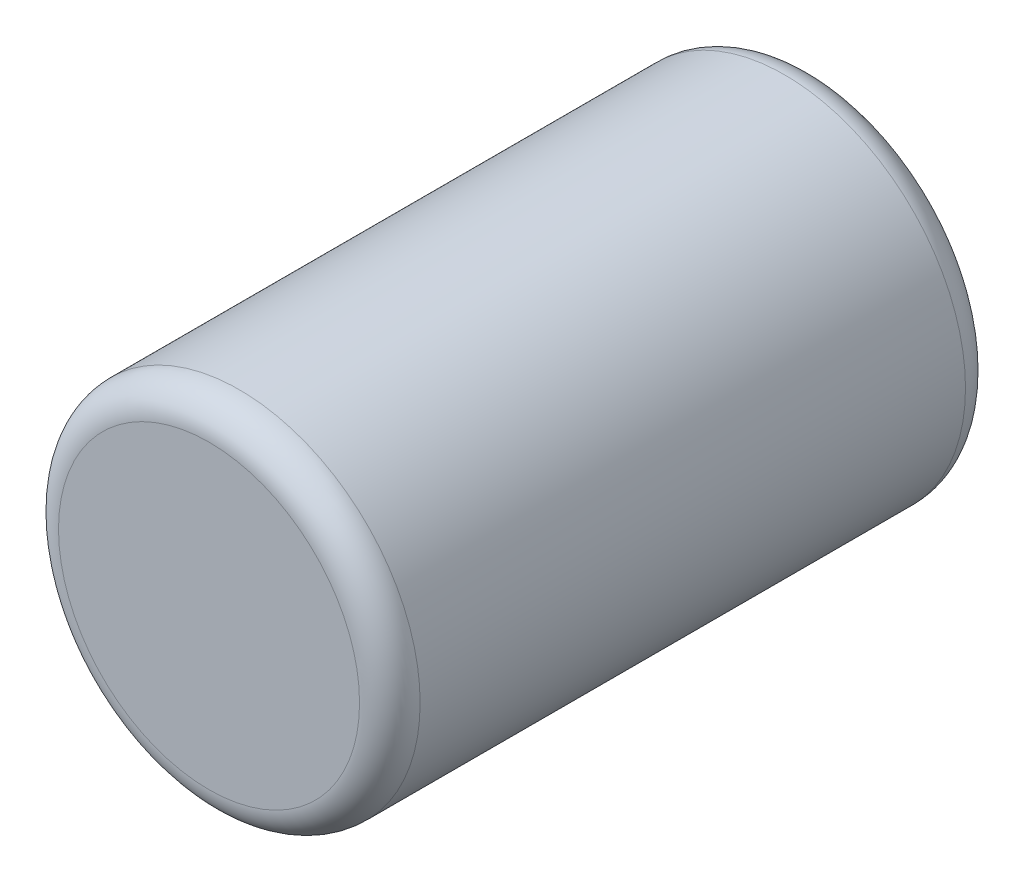
ISO-10303-21;
HEADER;
FILE_DESCRIPTION(('STEP AP214'),'2;1');
FILE_NAME('part.step','',(''),(''),'','','');
FILE_SCHEMA(('AUTOMOTIVE_DESIGN { 1 0 10303 214 1 1 1 1 }'));
ENDSEC;
DATA;
#1=APPLICATION_CONTEXT('core data for automotive mechanical design processes');
#2=APPLICATION_PROTOCOL_DEFINITION('international standard','automotive_design',2000,#1);
#3=PRODUCT_CONTEXT('',#1,'mechanical');
#4=PRODUCT('Part','Part','',(#3));
#5=PRODUCT_RELATED_PRODUCT_CATEGORY('part','',(#4));
#6=PRODUCT_DEFINITION_FORMATION('','',#4);
#7=PRODUCT_DEFINITION_CONTEXT('part definition',#1,'design');
#8=PRODUCT_DEFINITION('design','',#6,#7);
#9=PRODUCT_DEFINITION_SHAPE('','',#8);
#10=(LENGTH_UNIT() NAMED_UNIT(*) SI_UNIT(.MILLI.,.METRE.));
#11=(NAMED_UNIT(*) PLANE_ANGLE_UNIT() SI_UNIT($,.RADIAN.));
#12=(NAMED_UNIT(*) SI_UNIT($,.STERADIAN.) SOLID_ANGLE_UNIT());
#13=UNCERTAINTY_MEASURE_WITH_UNIT(LENGTH_MEASURE(1.E-05),#10,'distance_accuracy_value','');
#14=(GEOMETRIC_REPRESENTATION_CONTEXT(3) GLOBAL_UNCERTAINTY_ASSIGNED_CONTEXT((#13)) GLOBAL_UNIT_ASSIGNED_CONTEXT((#10,
#11,#12)) REPRESENTATION_CONTEXT('',''));
#15=CARTESIAN_POINT('',(0.,0.,0.));
#16=DIRECTION('',(0.,0.,1.));
#17=DIRECTION('',(1.,0.,0.));
#18=AXIS2_PLACEMENT_3D('',#15,#16,#17);
#19=CARTESIAN_POINT('',(0.,0.,127.));
#20=DIRECTION('',(0.,0.,-1.));
#21=DIRECTION('',(-1.,0.,0.));
#22=AXIS2_PLACEMENT_3D('',#19,#20,#21);
#23=CYLINDRICAL_SURFACE('',#22,37.8968);
#24=CARTESIAN_POINT('',(0.,0.,6.34999999999999));
#25=DIRECTION('',(0.,0.,1.));
#26=DIRECTION('',(1.,0.,0.));
#27=AXIS2_PLACEMENT_3D('',#24,#25,#26);
#28=CIRCLE('',#27,37.8968);
#29=CARTESIAN_POINT('',(37.8968,0.,6.34999999999999));
#30=VERTEX_POINT('',#29);
#31=EDGE_CURVE('E45',#30,#30,#28,.T.);
#32=ORIENTED_EDGE('',*,*,#31,.T.);
#33=EDGE_LOOP('',(#32));
#34=FACE_BOUND('',#33,.T.);
#35=CARTESIAN_POINT('',(0.,0.,120.65));
#36=DIRECTION('',(0.,0.,1.));
#37=DIRECTION('',(1.,0.,0.));
#38=AXIS2_PLACEMENT_3D('',#35,#36,#37);
#39=CIRCLE('',#38,37.8968);
#40=CARTESIAN_POINT('',(37.8968,0.,120.65));
#41=VERTEX_POINT('',#40);
#42=EDGE_CURVE('E49',#41,#41,#39,.F.);
#43=ORIENTED_EDGE('',*,*,#42,.T.);
#44=EDGE_LOOP('',(#43));
#45=FACE_BOUND('',#44,.T.);
#46=ADVANCED_FACE('F34',(#34,#45),#23,.T.);
#47=CARTESIAN_POINT('',(0.,0.,127.));
#48=DIRECTION('',(0.,0.,1.));
#49=DIRECTION('',(1.,0.,0.));
#50=AXIS2_PLACEMENT_3D('',#47,#48,#49);
#51=PLANE('',#50);
#52=CARTESIAN_POINT('',(0.,0.,127.));
#53=DIRECTION('',(0.,0.,1.));
#54=DIRECTION('',(1.,0.,0.));
#55=AXIS2_PLACEMENT_3D('',#52,#53,#54);
#56=CIRCLE('',#55,31.5468);
#57=CARTESIAN_POINT('',(31.5468,0.,127.));
#58=VERTEX_POINT('',#57);
#59=EDGE_CURVE('E10',#58,#58,#56,.T.);
#60=ORIENTED_EDGE('',*,*,#59,.T.);
#61=EDGE_LOOP('',(#60));
#62=FACE_BOUND('',#61,.T.);
#63=ADVANCED_FACE('F65',(#62),#51,.T.);
#64=CARTESIAN_POINT('',(0.,0.,0.));
#65=DIRECTION('',(0.,0.,1.));
#66=DIRECTION('',(1.,0.,0.));
#67=AXIS2_PLACEMENT_3D('',#64,#65,#66);
#68=PLANE('',#67);
#69=CARTESIAN_POINT('',(0.,0.,0.));
#70=DIRECTION('',(0.,0.,1.));
#71=DIRECTION('',(1.,0.,0.));
#72=AXIS2_PLACEMENT_3D('',#69,#70,#71);
#73=CIRCLE('',#72,31.5468);
#74=CARTESIAN_POINT('',(31.5468,0.,0.));
#75=VERTEX_POINT('',#74);
#76=EDGE_CURVE('E41',#75,#75,#73,.F.);
#77=ORIENTED_EDGE('',*,*,#76,.T.);
#78=EDGE_LOOP('',(#77));
#79=FACE_BOUND('',#78,.T.);
#80=ADVANCED_FACE('F62',(#79),#68,.F.);
#81=CARTESIAN_POINT('',(0.,0.,6.34999999999999));
#82=DIRECTION('',(0.,0.,1.));
#83=DIRECTION('',(1.,0.,0.));
#84=AXIS2_PLACEMENT_3D('',#81,#82,#83);
#85=TOROIDAL_SURFACE('',#84,31.5468,6.35);
#86=ORIENTED_EDGE('',*,*,#76,.F.);
#87=EDGE_LOOP('',(#86));
#88=FACE_BOUND('',#87,.T.);
#89=ORIENTED_EDGE('',*,*,#31,.F.);
#90=EDGE_LOOP('',(#89));
#91=FACE_BOUND('',#90,.T.);
#92=ADVANCED_FACE('F58',(#88,#91),#85,.T.);
#93=CARTESIAN_POINT('',(0.,0.,120.65));
#94=DIRECTION('',(0.,0.,1.));
#95=DIRECTION('',(1.,0.,0.));
#96=AXIS2_PLACEMENT_3D('',#93,#94,#95);
#97=TOROIDAL_SURFACE('',#96,31.5468,6.35);
#98=ORIENTED_EDGE('',*,*,#42,.F.);
#99=EDGE_LOOP('',(#98));
#100=FACE_BOUND('',#99,.T.);
#101=ORIENTED_EDGE('',*,*,#59,.F.);
#102=EDGE_LOOP('',(#101));
#103=FACE_BOUND('',#102,.T.);
#104=ADVANCED_FACE('F36',(#100,#103),#97,.T.);
#105=CLOSED_SHELL('',(#46,#63,#80,#92,#104));
#106=MANIFOLD_SOLID_BREP('B2',#105);
#107=ADVANCED_BREP_SHAPE_REPRESENTATION('',(#18,#106),#14);
#108=SHAPE_DEFINITION_REPRESENTATION(#9,#107);
ENDSEC;
END-ISO-10303-21;
